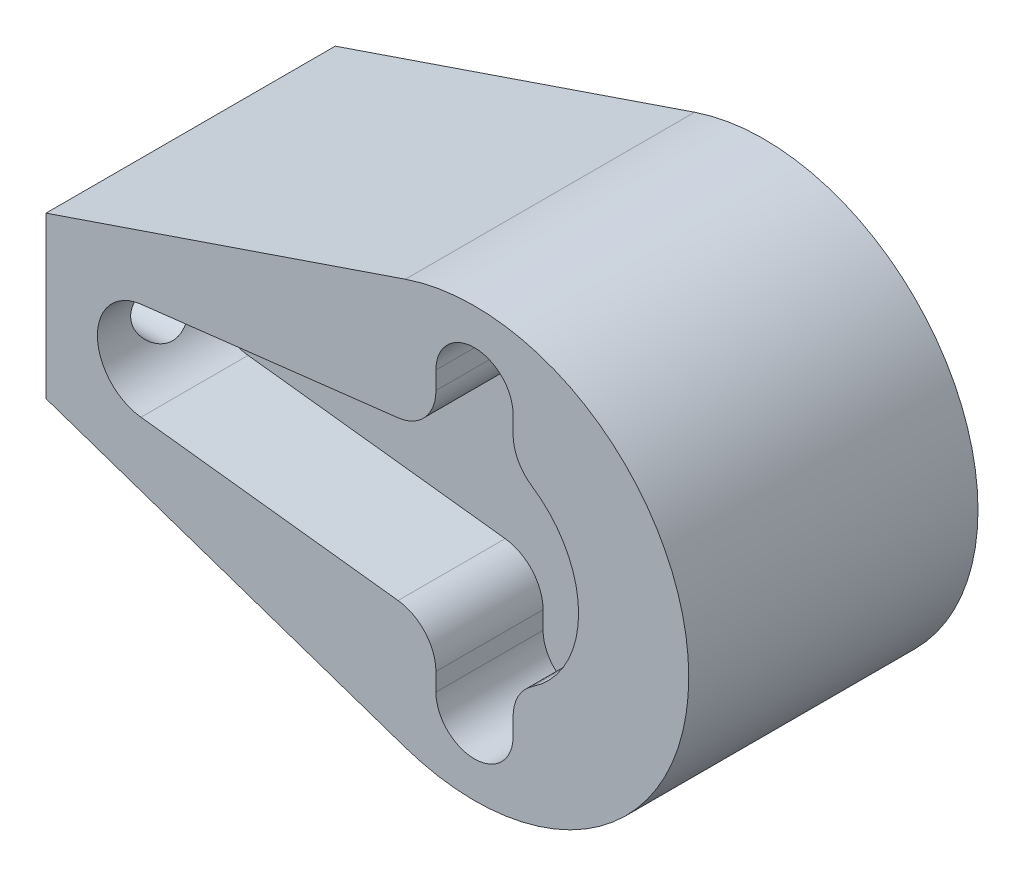
ISO-10303-21;
HEADER;
FILE_DESCRIPTION(('STEP AP214'),'2;1');
FILE_NAME('part.step','',(''),(''),'','','');
FILE_SCHEMA(('AUTOMOTIVE_DESIGN { 1 0 10303 214 1 1 1 1 }'));
ENDSEC;
DATA;
#1=APPLICATION_CONTEXT('core data for automotive mechanical design processes');
#2=APPLICATION_PROTOCOL_DEFINITION('international standard','automotive_design',2000,#1);
#3=PRODUCT_CONTEXT('',#1,'mechanical');
#4=PRODUCT('Part','Part','',(#3));
#5=PRODUCT_RELATED_PRODUCT_CATEGORY('part','',(#4));
#6=PRODUCT_DEFINITION_FORMATION('','',#4);
#7=PRODUCT_DEFINITION_CONTEXT('part definition',#1,'design');
#8=PRODUCT_DEFINITION('design','',#6,#7);
#9=PRODUCT_DEFINITION_SHAPE('','',#8);
#10=(LENGTH_UNIT() NAMED_UNIT(*) SI_UNIT(.MILLI.,.METRE.));
#11=(NAMED_UNIT(*) PLANE_ANGLE_UNIT() SI_UNIT($,.RADIAN.));
#12=(NAMED_UNIT(*) SI_UNIT($,.STERADIAN.) SOLID_ANGLE_UNIT());
#13=UNCERTAINTY_MEASURE_WITH_UNIT(LENGTH_MEASURE(1.E-05),#10,'distance_accuracy_value','');
#14=(GEOMETRIC_REPRESENTATION_CONTEXT(3) GLOBAL_UNCERTAINTY_ASSIGNED_CONTEXT((#13)) GLOBAL_UNIT_ASSIGNED_CONTEXT((#10,
#11,#12)) REPRESENTATION_CONTEXT('',''));
#15=CARTESIAN_POINT('',(0.,0.,0.));
#16=DIRECTION('',(0.,0.,1.));
#17=DIRECTION('',(1.,0.,0.));
#18=AXIS2_PLACEMENT_3D('',#15,#16,#17);
#19=CARTESIAN_POINT('',(0.,0.,5.));
#20=DIRECTION('',(0.,0.,1.));
#21=DIRECTION('',(1.,0.,0.));
#22=AXIS2_PLACEMENT_3D('',#19,#20,#21);
#23=PLANE('',#22);
#24=DIRECTION('',(-0.946562830415567,-0.322519469297081,0.));
#25=VECTOR('',#24,1.);
#26=CARTESIAN_POINT('',(-20.,3.75000000000001,5.));
#27=LINE('',#26,#25);
#28=CARTESIAN_POINT('',(-3.2251946929708,9.46562830415567,5.));
#29=VERTEX_POINT('',#28);
#30=CARTESIAN_POINT('',(-20.,3.75000000000001,5.));
#31=VERTEX_POINT('',#30);
#32=EDGE_CURVE('E306',#29,#31,#27,.T.);
#33=ORIENTED_EDGE('',*,*,#32,.T.);
#34=DIRECTION('',(0.,-1.,0.));
#35=VECTOR('',#34,1.);
#36=CARTESIAN_POINT('',(-20.,3.75000000000001,5.));
#37=LINE('',#36,#35);
#38=CARTESIAN_POINT('',(-20.,-3.74999999999999,5.));
#39=VERTEX_POINT('',#38);
#40=EDGE_CURVE('E308',#31,#39,#37,.T.);
#41=ORIENTED_EDGE('',*,*,#40,.T.);
#42=DIRECTION('',(0.946562830415567,-0.322519469297082,0.));
#43=VECTOR('',#42,1.);
#44=CARTESIAN_POINT('',(-3.22519469297081,-9.46562830415567,5.));
#45=LINE('',#44,#43);
#46=CARTESIAN_POINT('',(-3.22519469297081,-9.46562830415567,5.));
#47=VERTEX_POINT('',#46);
#48=EDGE_CURVE('E310',#39,#47,#45,.T.);
#49=ORIENTED_EDGE('',*,*,#48,.T.);
#50=CARTESIAN_POINT('',(0.,0.,5.));
#51=DIRECTION('',(0.,0.,1.));
#52=DIRECTION('',(1.,0.,0.));
#53=AXIS2_PLACEMENT_3D('',#50,#51,#52);
#54=CIRCLE('',#53,10.);
#55=EDGE_CURVE('E74',#47,#29,#54,.T.);
#56=ORIENTED_EDGE('',*,*,#55,.T.);
#57=EDGE_LOOP('',(#33,#41,#49,#56));
#58=FACE_BOUND('',#57,.T.);
#59=DIRECTION('',(0.,-1.,0.));
#60=VECTOR('',#59,1.);
#61=CARTESIAN_POINT('',(-1.8,6.51204514524833,5.));
#62=LINE('',#61,#60);
#63=CARTESIAN_POINT('',(-1.8,6.51204514524833,5.));
#64=VERTEX_POINT('',#63);
#65=CARTESIAN_POINT('',(-1.8,5.67902493282993,5.));
#66=VERTEX_POINT('',#65);
#67=EDGE_CURVE('E211',#64,#66,#62,.T.);
#68=ORIENTED_EDGE('',*,*,#67,.F.);
#69=CARTESIAN_POINT('',(0.,6.51204508312374,5.));
#70=DIRECTION('',(0.,0.,1.));
#71=DIRECTION('',(1.,0.,0.));
#72=AXIS2_PLACEMENT_3D('',#69,#70,#71);
#73=CIRCLE('',#72,1.8);
#74=CARTESIAN_POINT('',(1.8,6.51204508312374,5.));
#75=VERTEX_POINT('',#74);
#76=EDGE_CURVE('E209',#75,#64,#73,.T.);
#77=ORIENTED_EDGE('',*,*,#76,.F.);
#78=DIRECTION('',(0.,1.,0.));
#79=VECTOR('',#78,1.);
#80=CARTESIAN_POINT('',(1.8,5.70875526646588,5.));
#81=LINE('',#80,#79);
#82=CARTESIAN_POINT('',(1.8,5.70875526646588,5.));
#83=VERTEX_POINT('',#82);
#84=EDGE_CURVE('E236',#83,#75,#81,.T.);
#85=ORIENTED_EDGE('',*,*,#84,.F.);
#86=CARTESIAN_POINT('',(3.8,5.70875526646588,5.));
#87=DIRECTION('',(0.,0.,-1.));
#88=DIRECTION('',(-1.,0.,0.));
#89=AXIS2_PLACEMENT_3D('',#86,#87,#88);
#90=CIRCLE('',#89,2.);
#91=CARTESIAN_POINT('',(2.69177836052674,4.04386944521471,5.));
#92=VERTEX_POINT('',#91);
#93=EDGE_CURVE('E234',#92,#83,#90,.T.);
#94=ORIENTED_EDGE('',*,*,#93,.F.);
#95=CARTESIAN_POINT('',(0.,0.,5.));
#96=DIRECTION('',(0.,0.,1.));
#97=DIRECTION('',(-1.,0.,0.));
#98=AXIS2_PLACEMENT_3D('',#95,#96,#97);
#99=CIRCLE('',#98,4.85783396506521);
#100=CARTESIAN_POINT('',(2.69177836052674,-4.04386944521471,5.));
#101=VERTEX_POINT('',#100);
#102=EDGE_CURVE('E232',#101,#92,#99,.T.);
#103=ORIENTED_EDGE('',*,*,#102,.F.);
#104=CARTESIAN_POINT('',(3.8,-5.70875526646588,5.));
#105=DIRECTION('',(0.,0.,-1.));
#106=DIRECTION('',(1.,0.,0.));
#107=AXIS2_PLACEMENT_3D('',#104,#105,#106);
#108=CIRCLE('',#107,2.);
#109=CARTESIAN_POINT('',(1.8,-5.70875526646588,5.));
#110=VERTEX_POINT('',#109);
#111=EDGE_CURVE('E230',#110,#101,#108,.T.);
#112=ORIENTED_EDGE('',*,*,#111,.F.);
#113=DIRECTION('',(0.,1.,0.));
#114=VECTOR('',#113,1.);
#115=CARTESIAN_POINT('',(1.8,-6.51204508312374,5.));
#116=LINE('',#115,#114);
#117=CARTESIAN_POINT('',(1.8,-6.51204508312374,5.));
#118=VERTEX_POINT('',#117);
#119=EDGE_CURVE('E228',#118,#110,#116,.T.);
#120=ORIENTED_EDGE('',*,*,#119,.F.);
#121=CARTESIAN_POINT('',(0.,-6.51204508312374,5.));
#122=DIRECTION('',(0.,0.,1.));
#123=DIRECTION('',(1.,0.,0.));
#124=AXIS2_PLACEMENT_3D('',#121,#122,#123);
#125=CIRCLE('',#124,1.8);
#126=CARTESIAN_POINT('',(-1.8,-6.51204508312374,5.));
#127=VERTEX_POINT('',#126);
#128=EDGE_CURVE('E226',#127,#118,#125,.T.);
#129=ORIENTED_EDGE('',*,*,#128,.F.);
#130=DIRECTION('',(0.,-1.,0.));
#131=VECTOR('',#130,1.);
#132=CARTESIAN_POINT('',(-1.8,-5.67902487070535,5.));
#133=LINE('',#132,#131);
#134=CARTESIAN_POINT('',(-1.8,-5.67902487070535,5.));
#135=VERTEX_POINT('',#134);
#136=EDGE_CURVE('E224',#135,#127,#133,.T.);
#137=ORIENTED_EDGE('',*,*,#136,.F.);
#138=CARTESIAN_POINT('',(-3.8,-5.67902487070535,5.));
#139=DIRECTION('',(0.,0.,-1.));
#140=DIRECTION('',(1.,0.,0.));
#141=AXIS2_PLACEMENT_3D('',#138,#139,#140);
#142=CIRCLE('',#141,2.);
#143=CARTESIAN_POINT('',(-3.56690060413346,-3.6926551489147,5.));
#144=VERTEX_POINT('',#143);
#145=EDGE_CURVE('E222',#144,#135,#142,.T.);
#146=ORIENTED_EDGE('',*,*,#145,.F.);
#147=DIRECTION('',(0.993184860895324,-0.116549697933267,0.));
#148=VECTOR('',#147,1.);
#149=CARTESIAN_POINT('',(-15.5680643052465,-2.28432518005924,5.));
#150=LINE('',#149,#148);
#151=CARTESIAN_POINT('',(-15.5680643052465,-2.28432518005924,5.));
#152=VERTEX_POINT('',#151);
#153=EDGE_CURVE('E220',#152,#144,#150,.T.);
#154=ORIENTED_EDGE('',*,*,#153,.F.);
#155=CARTESIAN_POINT('',(-15.3,0.,5.));
#156=DIRECTION('',(0.,0.,1.));
#157=DIRECTION('',(1.,0.,0.));
#158=AXIS2_PLACEMENT_3D('',#155,#156,#157);
#159=CIRCLE('',#158,2.3);
#160=CARTESIAN_POINT('',(-15.5680642879125,2.28432518209339,5.));
#161=VERTEX_POINT('',#160);
#162=EDGE_CURVE('E218',#161,#152,#159,.T.);
#163=ORIENTED_EDGE('',*,*,#162,.F.);
#164=DIRECTION('',(-0.993184860300195,-0.116549703004697,0.));
#165=VECTOR('',#164,1.);
#166=CARTESIAN_POINT('',(-3.5669005939906,3.69265521222954,5.));
#167=LINE('',#166,#165);
#168=CARTESIAN_POINT('',(-3.5669005939906,3.69265521222954,5.));
#169=VERTEX_POINT('',#168);
#170=EDGE_CURVE('E216',#169,#161,#167,.T.);
#171=ORIENTED_EDGE('',*,*,#170,.F.);
#172=CARTESIAN_POINT('',(-3.8,5.67902493282993,5.));
#173=DIRECTION('',(0.,0.,-1.));
#174=DIRECTION('',(-1.,0.,0.));
#175=AXIS2_PLACEMENT_3D('',#172,#173,#174);
#176=CIRCLE('',#175,2.);
#177=EDGE_CURVE('E214',#66,#169,#176,.T.);
#178=ORIENTED_EDGE('',*,*,#177,.F.);
#179=EDGE_LOOP('',(#68,#77,#85,#94,#103,#112,#120,#129,#137,#146,#154,#163,#171,#178));
#180=FACE_BOUND('',#179,.T.);
#181=ADVANCED_FACE('F45',(#58,#180),#23,.T.);
#182=CARTESIAN_POINT('',(-20.,3.75000000000001,5.));
#183=DIRECTION('',(0.322519469297081,-0.946562830415567,0.));
#184=DIRECTION('',(0.946562830415567,0.322519469297081,0.));
#185=AXIS2_PLACEMENT_3D('',#182,#183,#184);
#186=PLANE('',#185);
#187=DIRECTION('',(0.,0.,-1.));
#188=VECTOR('',#187,1.);
#189=CARTESIAN_POINT('',(-3.2251946929708,9.46562830415567,5.));
#190=LINE('',#189,#188);
#191=CARTESIAN_POINT('',(-3.2251946929708,9.46562830415567,-8.5));
#192=VERTEX_POINT('',#191);
#193=EDGE_CURVE('E185',#29,#192,#190,.T.);
#194=ORIENTED_EDGE('',*,*,#193,.T.);
#195=DIRECTION('',(-0.946562830415567,-0.322519469297081,0.));
#196=VECTOR('',#195,1.);
#197=CARTESIAN_POINT('',(-3.22519469297081,9.46562830415567,-8.5));
#198=LINE('',#197,#196);
#199=CARTESIAN_POINT('',(-20.,3.75,-8.5));
#200=VERTEX_POINT('',#199);
#201=EDGE_CURVE('E195',#192,#200,#198,.T.);
#202=ORIENTED_EDGE('',*,*,#201,.T.);
#203=DIRECTION('',(0.,0.,-1.));
#204=VECTOR('',#203,1.);
#205=CARTESIAN_POINT('',(-20.,3.75000000000001,5.));
#206=LINE('',#205,#204);
#207=EDGE_CURVE('E59',#31,#200,#206,.T.);
#208=ORIENTED_EDGE('',*,*,#207,.F.);
#209=ORIENTED_EDGE('',*,*,#32,.F.);
#210=EDGE_LOOP('',(#194,#202,#208,#209));
#211=FACE_BOUND('',#210,.T.);
#212=ADVANCED_FACE('F47',(#211),#186,.F.);
#213=CARTESIAN_POINT('',(-20.,3.75000000000001,5.));
#214=DIRECTION('',(1.,0.,0.));
#215=DIRECTION('',(0.,0.,-1.));
#216=AXIS2_PLACEMENT_3D('',#213,#214,#215);
#217=PLANE('',#216);
#218=CARTESIAN_POINT('',(-20.,0.,-5.49999999999995));
#219=DIRECTION('',(-1.,0.,0.));
#220=DIRECTION('',(0.,0.,1.));
#221=AXIS2_PLACEMENT_3D('',#218,#219,#220);
#222=CIRCLE('',#221,1.45);
#223=CARTESIAN_POINT('',(-20.,0.,-4.04999999999995));
#224=VERTEX_POINT('',#223);
#225=EDGE_CURVE('E419',#224,#224,#222,.T.);
#226=ORIENTED_EDGE('',*,*,#225,.F.);
#227=EDGE_LOOP('',(#226));
#228=FACE_BOUND('',#227,.T.);
#229=CARTESIAN_POINT('',(-20.,0.,2.));
#230=DIRECTION('',(-1.,0.,0.));
#231=DIRECTION('',(0.,0.,1.));
#232=AXIS2_PLACEMENT_3D('',#229,#230,#231);
#233=CIRCLE('',#232,1.45);
#234=CARTESIAN_POINT('',(-20.,0.,3.45));
#235=VERTEX_POINT('',#234);
#236=EDGE_CURVE('E422',#235,#235,#233,.T.);
#237=ORIENTED_EDGE('',*,*,#236,.F.);
#238=EDGE_LOOP('',(#237));
#239=FACE_BOUND('',#238,.T.);
#240=ORIENTED_EDGE('',*,*,#207,.T.);
#241=DIRECTION('',(0.,-1.,0.));
#242=VECTOR('',#241,1.);
#243=CARTESIAN_POINT('',(-20.,0.,-8.5));
#244=LINE('',#243,#242);
#245=CARTESIAN_POINT('',(-20.,-3.74999999999999,-8.5));
#246=VERTEX_POINT('',#245);
#247=EDGE_CURVE('E206',#200,#246,#244,.T.);
#248=ORIENTED_EDGE('',*,*,#247,.T.);
#249=DIRECTION('',(0.,0.,-1.));
#250=VECTOR('',#249,1.);
#251=CARTESIAN_POINT('',(-20.,-3.74999999999999,5.));
#252=LINE('',#251,#250);
#253=EDGE_CURVE('E184',#39,#246,#252,.T.);
#254=ORIENTED_EDGE('',*,*,#253,.F.);
#255=ORIENTED_EDGE('',*,*,#40,.F.);
#256=EDGE_LOOP('',(#240,#248,#254,#255));
#257=FACE_BOUND('',#256,.T.);
#258=ADVANCED_FACE('F317',(#228,#239,#257),#217,.F.);
#259=CARTESIAN_POINT('',(-3.22519469297081,-9.46562830415567,5.));
#260=DIRECTION('',(0.322519469297082,0.946562830415567,0.));
#261=DIRECTION('',(-0.946562830415567,0.322519469297082,0.));
#262=AXIS2_PLACEMENT_3D('',#259,#260,#261);
#263=PLANE('',#262);
#264=ORIENTED_EDGE('',*,*,#253,.T.);
#265=DIRECTION('',(0.946562830415567,-0.322519469297082,0.));
#266=VECTOR('',#265,1.);
#267=CARTESIAN_POINT('',(-3.22519469297082,-9.46562830415567,-8.5));
#268=LINE('',#267,#266);
#269=CARTESIAN_POINT('',(-3.22519469297081,-9.46562830415567,-8.5));
#270=VERTEX_POINT('',#269);
#271=EDGE_CURVE('E192',#246,#270,#268,.T.);
#272=ORIENTED_EDGE('',*,*,#271,.T.);
#273=DIRECTION('',(0.,0.,-1.));
#274=VECTOR('',#273,1.);
#275=CARTESIAN_POINT('',(-3.22519469297081,-9.46562830415567,5.));
#276=LINE('',#275,#274);
#277=EDGE_CURVE('E177',#47,#270,#276,.T.);
#278=ORIENTED_EDGE('',*,*,#277,.F.);
#279=ORIENTED_EDGE('',*,*,#48,.F.);
#280=EDGE_LOOP('',(#264,#272,#278,#279));
#281=FACE_BOUND('',#280,.T.);
#282=ADVANCED_FACE('F197',(#281),#263,.F.);
#283=CARTESIAN_POINT('',(0.,0.,5.));
#284=DIRECTION('',(0.,0.,-1.));
#285=DIRECTION('',(-1.,0.,0.));
#286=AXIS2_PLACEMENT_3D('',#283,#284,#285);
#287=CYLINDRICAL_SURFACE('',#286,10.);
#288=ORIENTED_EDGE('',*,*,#277,.T.);
#289=CARTESIAN_POINT('',(0.,0.,-8.5));
#290=DIRECTION('',(0.,0.,1.));
#291=DIRECTION('',(1.,0.,0.));
#292=AXIS2_PLACEMENT_3D('',#289,#290,#291);
#293=CIRCLE('',#292,10.);
#294=EDGE_CURVE('E180',#270,#192,#293,.T.);
#295=ORIENTED_EDGE('',*,*,#294,.T.);
#296=ORIENTED_EDGE('',*,*,#193,.F.);
#297=ORIENTED_EDGE('',*,*,#55,.F.);
#298=EDGE_LOOP('',(#288,#295,#296,#297));
#299=FACE_BOUND('',#298,.T.);
#300=ADVANCED_FACE('F179',(#299),#287,.T.);
#301=CARTESIAN_POINT('',(0.,6.51204508312374,5.));
#302=DIRECTION('',(0.,0.,-1.));
#303=DIRECTION('',(-1.,0.,0.));
#304=AXIS2_PLACEMENT_3D('',#301,#302,#303);
#305=CYLINDRICAL_SURFACE('',#304,1.8);
#306=CARTESIAN_POINT('',(0.,6.51204508312374,0.));
#307=DIRECTION('',(0.,0.,1.));
#308=DIRECTION('',(1.,0.,0.));
#309=AXIS2_PLACEMENT_3D('',#306,#307,#308);
#310=CIRCLE('',#309,1.8);
#311=CARTESIAN_POINT('',(1.8,6.51204508312374,0.));
#312=VERTEX_POINT('',#311);
#313=CARTESIAN_POINT('',(-1.8,6.51204514524833,0.));
#314=VERTEX_POINT('',#313);
#315=EDGE_CURVE('E208',#312,#314,#310,.T.);
#316=ORIENTED_EDGE('',*,*,#315,.F.);
#317=DIRECTION('',(0.,0.,-1.));
#318=VECTOR('',#317,1.);
#319=CARTESIAN_POINT('',(1.8,6.51204508312374,5.));
#320=LINE('',#319,#318);
#321=EDGE_CURVE('E238',#75,#312,#320,.T.);
#322=ORIENTED_EDGE('',*,*,#321,.F.);
#323=ORIENTED_EDGE('',*,*,#76,.T.);
#324=DIRECTION('',(0.,0.,-1.));
#325=VECTOR('',#324,1.);
#326=CARTESIAN_POINT('',(-1.8,6.51204514524833,5.));
#327=LINE('',#326,#325);
#328=EDGE_CURVE('E303',#64,#314,#327,.T.);
#329=ORIENTED_EDGE('',*,*,#328,.T.);
#330=EDGE_LOOP('',(#316,#322,#323,#329));
#331=FACE_BOUND('',#330,.T.);
#332=ADVANCED_FACE('F341',(#331),#305,.F.);
#333=CARTESIAN_POINT('',(-1.8,6.51204514524833,5.));
#334=DIRECTION('',(1.,0.,0.));
#335=DIRECTION('',(0.,0.,-1.));
#336=AXIS2_PLACEMENT_3D('',#333,#334,#335);
#337=PLANE('',#336);
#338=DIRECTION('',(0.,-1.,0.));
#339=VECTOR('',#338,1.);
#340=CARTESIAN_POINT('',(-1.8,6.51204514524833,0.));
#341=LINE('',#340,#339);
#342=CARTESIAN_POINT('',(-1.8,5.67902493282993,0.));
#343=VERTEX_POINT('',#342);
#344=EDGE_CURVE('E241',#314,#343,#341,.T.);
#345=ORIENTED_EDGE('',*,*,#344,.F.);
#346=ORIENTED_EDGE('',*,*,#328,.F.);
#347=ORIENTED_EDGE('',*,*,#67,.T.);
#348=DIRECTION('',(0.,0.,-1.));
#349=VECTOR('',#348,1.);
#350=CARTESIAN_POINT('',(-1.8,5.67902493282993,5.));
#351=LINE('',#350,#349);
#352=EDGE_CURVE('E301',#66,#343,#351,.T.);
#353=ORIENTED_EDGE('',*,*,#352,.T.);
#354=EDGE_LOOP('',(#345,#346,#347,#353));
#355=FACE_BOUND('',#354,.T.);
#356=ADVANCED_FACE('F331',(#355),#337,.T.);
#357=CARTESIAN_POINT('',(-3.8,5.67902493282993,5.));
#358=DIRECTION('',(0.,0.,-1.));
#359=DIRECTION('',(-1.,0.,0.));
#360=AXIS2_PLACEMENT_3D('',#357,#358,#359);
#361=CYLINDRICAL_SURFACE('',#360,2.);
#362=CARTESIAN_POINT('',(-3.8,5.67902493282993,0.));
#363=DIRECTION('',(0.,0.,-1.));
#364=DIRECTION('',(-1.,0.,0.));
#365=AXIS2_PLACEMENT_3D('',#362,#363,#364);
#366=CIRCLE('',#365,2.);
#367=CARTESIAN_POINT('',(-3.5669005939906,3.69265521222954,0.));
#368=VERTEX_POINT('',#367);
#369=EDGE_CURVE('E244',#343,#368,#366,.T.);
#370=ORIENTED_EDGE('',*,*,#369,.F.);
#371=ORIENTED_EDGE('',*,*,#352,.F.);
#372=ORIENTED_EDGE('',*,*,#177,.T.);
#373=DIRECTION('',(0.,0.,-1.));
#374=VECTOR('',#373,1.);
#375=CARTESIAN_POINT('',(-3.5669005939906,3.69265521222954,5.));
#376=LINE('',#375,#374);
#377=EDGE_CURVE('E299',#169,#368,#376,.T.);
#378=ORIENTED_EDGE('',*,*,#377,.T.);
#379=EDGE_LOOP('',(#370,#371,#372,#378));
#380=FACE_BOUND('',#379,.T.);
#381=ADVANCED_FACE('F334',(#380),#361,.T.);
#382=CARTESIAN_POINT('',(-3.5669005939906,3.69265521222954,5.));
#383=DIRECTION('',(0.116549703004697,-0.993184860300194,0.));
#384=DIRECTION('',(0.993184860300195,0.116549703004697,0.));
#385=AXIS2_PLACEMENT_3D('',#382,#383,#384);
#386=PLANE('',#385);
#387=DIRECTION('',(-0.993184860300195,-0.116549703004697,0.));
#388=VECTOR('',#387,1.);
#389=CARTESIAN_POINT('',(-3.5669005939906,3.69265521222954,0.));
#390=LINE('',#389,#388);
#391=CARTESIAN_POINT('',(-15.5680642879125,2.28432518209339,0.));
#392=VERTEX_POINT('',#391);
#393=EDGE_CURVE('E247',#368,#392,#390,.T.);
#394=ORIENTED_EDGE('',*,*,#393,.F.);
#395=ORIENTED_EDGE('',*,*,#377,.F.);
#396=ORIENTED_EDGE('',*,*,#170,.T.);
#397=DIRECTION('',(0.,0.,-1.));
#398=VECTOR('',#397,1.);
#399=CARTESIAN_POINT('',(-15.5680642879125,2.28432518209339,5.));
#400=LINE('',#399,#398);
#401=EDGE_CURVE('E297',#161,#392,#400,.T.);
#402=ORIENTED_EDGE('',*,*,#401,.T.);
#403=EDGE_LOOP('',(#394,#395,#396,#402));
#404=FACE_BOUND('',#403,.T.);
#405=ADVANCED_FACE('F390',(#404),#386,.T.);
#406=CARTESIAN_POINT('',(-15.3,0.,5.));
#407=DIRECTION('',(0.,0.,-1.));
#408=DIRECTION('',(-1.,0.,0.));
#409=AXIS2_PLACEMENT_3D('',#406,#407,#408);
#410=CYLINDRICAL_SURFACE('',#409,2.3);
#411=CARTESIAN_POINT('',(-17.6,0.,3.45));
#412=CARTESIAN_POINT('',(-17.5999952348965,-0.0735620306128953,3.44999489466359));
#413=CARTESIAN_POINT('',(-17.5964344010985,-0.147204816500886,3.44436454038917));
#414=CARTESIAN_POINT('',(-17.5825288023698,-0.292222150830422,3.42214972007909));
#415=CARTESIAN_POINT('',(-17.5721719631101,-0.363592424662499,3.40554575707086));
#416=CARTESIAN_POINT('',(-17.5457137552372,-0.501687146257933,3.36235803067236));
#417=CARTESIAN_POINT('',(-17.5296408024331,-0.568432657758621,3.33582359983808));
#418=CARTESIAN_POINT('',(-17.4930826736694,-0.696287490334186,3.27386660131413));
#419=CARTESIAN_POINT('',(-17.4725978628067,-0.757397277187965,3.23844476904842));
#420=CARTESIAN_POINT('',(-17.426950125782,-0.877812735953125,3.15657513173879));
#421=CARTESIAN_POINT('',(-17.4015432742224,-0.93657646197989,3.10946895478235));
#422=CARTESIAN_POINT('',(-17.3493374345192,-1.04589405901631,3.0070873648058));
#423=CARTESIAN_POINT('',(-17.3225365901337,-1.09643659311134,2.95180086840201));
#424=CARTESIAN_POINT('',(-17.2661214190627,-1.19499512553422,2.82568309784669));
#425=CARTESIAN_POINT('',(-17.2366305522551,-1.24169517024988,2.75375944254787));
#426=CARTESIAN_POINT('',(-17.1825785767486,-1.32221621662578,2.6013636116136));
#427=CARTESIAN_POINT('',(-17.1580091248782,-1.35605910362773,2.52090626338433));
#428=CARTESIAN_POINT('',(-17.1233727634214,-1.40211061447188,2.37521648682557));
#429=CARTESIAN_POINT('',(-17.1111908897692,-1.41766875371427,2.31154918652));
#430=CARTESIAN_POINT('',(-17.0934485814678,-1.44005311205601,2.18183278976447));
#431=CARTESIAN_POINT('',(-17.0878785392774,-1.4468920020236,2.11578729327668));
#432=CARTESIAN_POINT('',(-17.0842014340546,-1.45142555775087,1.98298188931665));
#433=CARTESIAN_POINT('',(-17.0861151605533,-1.44909475044668,1.91622050623561));
#434=CARTESIAN_POINT('',(-17.0971425136219,-1.4353921070893,1.78422051904625));
#435=CARTESIAN_POINT('',(-17.1062619769334,-1.42401294169937,1.71898319356854));
#436=CARTESIAN_POINT('',(-17.1300673897753,-1.39327464868554,1.59334462871705));
#437=CARTESIAN_POINT('',(-17.1446068273489,-1.37412447435822,1.53286283425977));
#438=CARTESIAN_POINT('',(-17.177649994476,-1.32861564637027,1.41585421448835));
#439=CARTESIAN_POINT('',(-17.1961551171488,-1.302254458626,1.35932878830152));
#440=CARTESIAN_POINT('',(-17.2392715562425,-1.23734120926279,1.2404600473076));
#441=CARTESIAN_POINT('',(-17.264375690463,-1.19742614584487,1.17904032558527));
#442=CARTESIAN_POINT('',(-17.3155868086833,-1.10906437514527,1.06309122376005));
#443=CARTESIAN_POINT('',(-17.3416948134388,-1.0606087941761,1.00856911255495));
#444=CARTESIAN_POINT('',(-17.3972097521984,-0.946769276272597,0.898445536758642));
#445=CARTESIAN_POINT('',(-17.4264174097691,-0.87990748206543,0.844253687586904));
#446=CARTESIAN_POINT('',(-17.4802891263742,-0.736347084624815,0.747900556502855));
#447=CARTESIAN_POINT('',(-17.5049547925712,-0.659651977221197,0.705735016226869));
#448=CARTESIAN_POINT('',(-17.5458676970746,-0.502328351889401,0.637232229649256));
#449=CARTESIAN_POINT('',(-17.5624835711877,-0.422106839363462,0.610190670448062));
#450=CARTESIAN_POINT('',(-17.5871175677954,-0.256958383189033,0.570435196717669));
#451=CARTESIAN_POINT('',(-17.5951482982089,-0.172038532839721,0.55770027043614));
#452=CARTESIAN_POINT('',(-17.6011094199397,-0.0139062419855043,0.548239002867977));
#453=CARTESIAN_POINT('',(-17.6003825074458,0.0591365720717499,0.549384698433762));
#454=CARTESIAN_POINT('',(-17.5920948248622,0.203831017840856,0.562562662255785));
#455=CARTESIAN_POINT('',(-17.5845346085094,0.27548276179755,0.574594048389775));
#456=CARTESIAN_POINT('',(-17.5637556349584,0.412313766043555,0.608147587689575));
#457=CARTESIAN_POINT('',(-17.5507920606776,0.477638746985116,0.629242917532434));
#458=CARTESIAN_POINT('',(-17.5202944320549,0.603742580802657,0.679918100815014));
#459=CARTESIAN_POINT('',(-17.5027596365758,0.664520694431703,0.709499330161094));
#460=CARTESIAN_POINT('',(-17.462425177632,0.786409671325798,0.779555368406544));
#461=CARTESIAN_POINT('',(-17.4392744090311,0.846946255053388,0.820823627535912));
#462=CARTESIAN_POINT('',(-17.390689613049,0.960650046320786,0.911447193796371));
#463=CARTESIAN_POINT('',(-17.3652531080108,1.01380909417649,0.960811325557832));
#464=CARTESIAN_POINT('',(-17.3102073056508,1.11942514034986,1.07464612717275));
#465=CARTESIAN_POINT('',(-17.2805379463955,1.17061212571905,1.14027134375415));
#466=CARTESIAN_POINT('',(-17.2239534301028,1.26145429803293,1.28015500446158));
#467=CARTESIAN_POINT('',(-17.1970366223709,1.30111642298745,1.35440821665069));
#468=CARTESIAN_POINT('',(-17.1546600984789,1.36061976148053,1.49430113521248));
#469=CARTESIAN_POINT('',(-17.1379821458822,1.38286417075097,1.5585437897373));
#470=CARTESIAN_POINT('',(-17.1108026495284,1.41827300878612,1.69070289273759));
#471=CARTESIAN_POINT('',(-17.1002912848323,1.43145188117914,1.75861331047763));
#472=CARTESIAN_POINT('',(-17.0870077711023,1.44800737277798,1.89683697720636));
#473=CARTESIAN_POINT('',(-17.084283659644,1.45132315416024,1.96716244379555));
#474=CARTESIAN_POINT('',(-17.0872086822455,1.44771848937246,2.10738653098096));
#475=CARTESIAN_POINT('',(-17.0928600167598,1.44079535316489,2.17728503455742));
#476=CARTESIAN_POINT('',(-17.1107131077057,1.41827174300572,2.3082772997176));
#477=CARTESIAN_POINT('',(-17.1222935326362,1.40348997017075,2.36960405907805));
#478=CARTESIAN_POINT('',(-17.1501628662752,1.36653963338584,2.48884570593964));
#479=CARTESIAN_POINT('',(-17.1664538205535,1.3443678596528,2.54675909798867));
#480=CARTESIAN_POINT('',(-17.2047162257004,1.28969646023056,2.66641095920689));
#481=CARTESIAN_POINT('',(-17.2271655297386,1.25617844430606,2.72752823712582));
#482=CARTESIAN_POINT('',(-17.2740206169282,1.18118625036807,2.84385756991415));
#483=CARTESIAN_POINT('',(-17.2984279432207,1.13970576045437,2.89906488547626));
#484=CARTESIAN_POINT('',(-17.3523480637841,1.04004734065751,3.01375409626789));
#485=CARTESIAN_POINT('',(-17.3818789003488,0.9801898473691,3.07178148920097));
#486=CARTESIAN_POINT('',(-17.4381215821485,0.850546596371728,3.17730811945012));
#487=CARTESIAN_POINT('',(-17.464831492182,0.780754099167484,3.22480015360291));
#488=CARTESIAN_POINT('',(-17.5129382882932,0.631737420989186,3.30795888387403));
#489=CARTESIAN_POINT('',(-17.5342808472175,0.552427935034664,3.34350579870685));
#490=CARTESIAN_POINT('',(-17.568721051406,0.387239185676793,3.40003681158557));
#491=CARTESIAN_POINT('',(-17.5818472879828,0.301383884129032,3.42107143619192));
#492=CARTESIAN_POINT('',(-17.5933259151269,0.178693315661015,3.43939403153303));
#493=CARTESIAN_POINT('',(-17.5958210978622,0.143125230588924,3.44336352112601));
#494=CARTESIAN_POINT('',(-17.5991593503587,0.071711173110535,3.44866782717223));
#495=CARTESIAN_POINT('',(-17.6000023232273,0.0358651845305357,3.45000248910791));
#496=CARTESIAN_POINT('',(-17.6,0.,3.45));
#497=B_SPLINE_CURVE_WITH_KNOTS('',3,(#411,#412,#413,#414,#415,#416,#417,#418,#419,#420,#421,
#422,#423,#424,#425,#426,#427,#428,#429,#430,#431,#432,#433,#434,#435,#436,#437,#438,#439,#440,
#441,#442,#443,#444,#445,#446,#447,#448,#449,#450,#451,#452,#453,#454,#455,#456,#457,#458,#459,
#460,#461,#462,#463,#464,#465,#466,#467,#468,#469,#470,#471,#472,#473,#474,#475,#476,#477,#478,
#479,#480,#481,#482,#483,#484,#485,#486,#487,#488,#489,#490,#491,#492,#493,#494,#495,#496),
.UNSPECIFIED.,.T.,.F.,(4,2,2,2,2,2,2,2,2,2,2,2,2,2,2,2,2,2,2,2,2,2,2,2,2,2,2,2,2,2,2,2,2,2,2,2,
2,2,2,2,2,2,4),(0.,0.22053607919336,0.441465045262475,0.66131074334776,0.881138255408335,
1.11867524445559,1.35653706665248,1.62729247291689,1.89758491439274,2.09674928714272,
2.29562390183599,2.49505137208029,2.69464054700826,2.88918532836884,3.0837985643918,
3.31524408654109,3.5469315160507,3.81823622716937,4.08944475312384,4.3466626712819,
4.60350232477148,4.82153731411336,5.03955463656595,5.24827027092186,5.45701976564096,
5.68664020787299,5.91651262417004,6.18043011786651,6.44418840149648,6.65336813503306,
6.86221381708503,7.07234506349236,7.28253152680702,7.47419009370381,7.66593201456026,
7.88484937121314,8.10394098698854,8.36807388613169,8.6323868235906,8.89927618056111,
9.1652315711215,9.27274768099725,9.38027009588996),.UNSPECIFIED.);
#498=CARTESIAN_POINT('',(-17.6,0.,3.45));
#499=VERTEX_POINT('',#498);
#500=EDGE_CURVE('E49',#499,#499,#497,.T.);
#501=ORIENTED_EDGE('',*,*,#500,.F.);
#502=EDGE_LOOP('',(#501));
#503=FACE_BOUND('',#502,.T.);
#504=CARTESIAN_POINT('',(-15.3,0.,0.));
#505=DIRECTION('',(0.,0.,1.));
#506=DIRECTION('',(1.,0.,0.));
#507=AXIS2_PLACEMENT_3D('',#504,#505,#506);
#508=CIRCLE('',#507,2.3);
#509=CARTESIAN_POINT('',(-15.5680643052465,-2.28432518005924,0.));
#510=VERTEX_POINT('',#509);
#511=EDGE_CURVE('E250',#392,#510,#508,.T.);
#512=ORIENTED_EDGE('',*,*,#511,.F.);
#513=ORIENTED_EDGE('',*,*,#401,.F.);
#514=ORIENTED_EDGE('',*,*,#162,.T.);
#515=DIRECTION('',(0.,0.,-1.));
#516=VECTOR('',#515,1.);
#517=CARTESIAN_POINT('',(-15.5680643052465,-2.28432518005924,5.));
#518=LINE('',#517,#516);
#519=EDGE_CURVE('E295',#152,#510,#518,.T.);
#520=ORIENTED_EDGE('',*,*,#519,.T.);
#521=EDGE_LOOP('',(#512,#513,#514,#520));
#522=FACE_BOUND('',#521,.T.);
#523=ADVANCED_FACE('F387',(#503,#522),#410,.F.);
#524=CARTESIAN_POINT('',(-15.5680643052465,-2.28432518005924,5.));
#525=DIRECTION('',(0.116549697933267,0.993184860895324,0.));
#526=DIRECTION('',(-0.993184860895324,0.116549697933267,0.));
#527=AXIS2_PLACEMENT_3D('',#524,#525,#526);
#528=PLANE('',#527);
#529=DIRECTION('',(0.993184860895324,-0.116549697933267,0.));
#530=VECTOR('',#529,1.);
#531=CARTESIAN_POINT('',(-15.5680643052465,-2.28432518005924,0.));
#532=LINE('',#531,#530);
#533=CARTESIAN_POINT('',(-3.56690060413346,-3.6926551489147,0.));
#534=VERTEX_POINT('',#533);
#535=EDGE_CURVE('E253',#510,#534,#532,.T.);
#536=ORIENTED_EDGE('',*,*,#535,.F.);
#537=ORIENTED_EDGE('',*,*,#519,.F.);
#538=ORIENTED_EDGE('',*,*,#153,.T.);
#539=DIRECTION('',(0.,0.,-1.));
#540=VECTOR('',#539,1.);
#541=CARTESIAN_POINT('',(-3.56690060413346,-3.6926551489147,5.));
#542=LINE('',#541,#540);
#543=EDGE_CURVE('E293',#144,#534,#542,.T.);
#544=ORIENTED_EDGE('',*,*,#543,.T.);
#545=EDGE_LOOP('',(#536,#537,#538,#544));
#546=FACE_BOUND('',#545,.T.);
#547=ADVANCED_FACE('F383',(#546),#528,.T.);
#548=CARTESIAN_POINT('',(-3.8,-5.67902487070535,5.));
#549=DIRECTION('',(0.,0.,-1.));
#550=DIRECTION('',(-1.,0.,0.));
#551=AXIS2_PLACEMENT_3D('',#548,#549,#550);
#552=CYLINDRICAL_SURFACE('',#551,2.);
#553=CARTESIAN_POINT('',(-3.8,-5.67902487070535,0.));
#554=DIRECTION('',(0.,0.,-1.));
#555=DIRECTION('',(1.,0.,0.));
#556=AXIS2_PLACEMENT_3D('',#553,#554,#555);
#557=CIRCLE('',#556,2.);
#558=CARTESIAN_POINT('',(-1.8,-5.67902487070535,0.));
#559=VERTEX_POINT('',#558);
#560=EDGE_CURVE('E256',#534,#559,#557,.T.);
#561=ORIENTED_EDGE('',*,*,#560,.F.);
#562=ORIENTED_EDGE('',*,*,#543,.F.);
#563=ORIENTED_EDGE('',*,*,#145,.T.);
#564=DIRECTION('',(0.,0.,-1.));
#565=VECTOR('',#564,1.);
#566=CARTESIAN_POINT('',(-1.8,-5.67902487070535,5.));
#567=LINE('',#566,#565);
#568=EDGE_CURVE('E291',#135,#559,#567,.T.);
#569=ORIENTED_EDGE('',*,*,#568,.T.);
#570=EDGE_LOOP('',(#561,#562,#563,#569));
#571=FACE_BOUND('',#570,.T.);
#572=ADVANCED_FACE('F380',(#571),#552,.T.);
#573=CARTESIAN_POINT('',(-1.8,-5.67902487070535,5.));
#574=DIRECTION('',(1.,0.,0.));
#575=DIRECTION('',(0.,0.,-1.));
#576=AXIS2_PLACEMENT_3D('',#573,#574,#575);
#577=PLANE('',#576);
#578=DIRECTION('',(0.,-1.,0.));
#579=VECTOR('',#578,1.);
#580=CARTESIAN_POINT('',(-1.8,-5.67902487070535,0.));
#581=LINE('',#580,#579);
#582=CARTESIAN_POINT('',(-1.8,-6.51204508312374,0.));
#583=VERTEX_POINT('',#582);
#584=EDGE_CURVE('E259',#559,#583,#581,.T.);
#585=ORIENTED_EDGE('',*,*,#584,.F.);
#586=ORIENTED_EDGE('',*,*,#568,.F.);
#587=ORIENTED_EDGE('',*,*,#136,.T.);
#588=DIRECTION('',(0.,0.,-1.));
#589=VECTOR('',#588,1.);
#590=CARTESIAN_POINT('',(-1.8,-6.51204508312374,5.));
#591=LINE('',#590,#589);
#592=EDGE_CURVE('E289',#127,#583,#591,.T.);
#593=ORIENTED_EDGE('',*,*,#592,.T.);
#594=EDGE_LOOP('',(#585,#586,#587,#593));
#595=FACE_BOUND('',#594,.T.);
#596=ADVANCED_FACE('F372',(#595),#577,.T.);
#597=CARTESIAN_POINT('',(0.,-6.51204508312374,5.));
#598=DIRECTION('',(0.,0.,-1.));
#599=DIRECTION('',(-1.,0.,0.));
#600=AXIS2_PLACEMENT_3D('',#597,#598,#599);
#601=CYLINDRICAL_SURFACE('',#600,1.8);
#602=CARTESIAN_POINT('',(0.,-6.51204508312374,0.));
#603=DIRECTION('',(0.,0.,1.));
#604=DIRECTION('',(1.,0.,0.));
#605=AXIS2_PLACEMENT_3D('',#602,#603,#604);
#606=CIRCLE('',#605,1.8);
#607=CARTESIAN_POINT('',(1.8,-6.51204508312374,0.));
#608=VERTEX_POINT('',#607);
#609=EDGE_CURVE('E262',#583,#608,#606,.T.);
#610=ORIENTED_EDGE('',*,*,#609,.F.);
#611=ORIENTED_EDGE('',*,*,#592,.F.);
#612=ORIENTED_EDGE('',*,*,#128,.T.);
#613=DIRECTION('',(0.,0.,-1.));
#614=VECTOR('',#613,1.);
#615=CARTESIAN_POINT('',(1.8,-6.51204508312374,5.));
#616=LINE('',#615,#614);
#617=EDGE_CURVE('E287',#118,#608,#616,.T.);
#618=ORIENTED_EDGE('',*,*,#617,.T.);
#619=EDGE_LOOP('',(#610,#611,#612,#618));
#620=FACE_BOUND('',#619,.T.);
#621=ADVANCED_FACE('F368',(#620),#601,.F.);
#622=CARTESIAN_POINT('',(1.8,-6.51204508312374,5.));
#623=DIRECTION('',(-1.,0.,0.));
#624=DIRECTION('',(0.,0.,1.));
#625=AXIS2_PLACEMENT_3D('',#622,#623,#624);
#626=PLANE('',#625);
#627=DIRECTION('',(0.,1.,0.));
#628=VECTOR('',#627,1.);
#629=CARTESIAN_POINT('',(1.8,-6.51204508312374,0.));
#630=LINE('',#629,#628);
#631=CARTESIAN_POINT('',(1.8,-5.70875526646588,0.));
#632=VERTEX_POINT('',#631);
#633=EDGE_CURVE('E265',#608,#632,#630,.T.);
#634=ORIENTED_EDGE('',*,*,#633,.F.);
#635=ORIENTED_EDGE('',*,*,#617,.F.);
#636=ORIENTED_EDGE('',*,*,#119,.T.);
#637=DIRECTION('',(0.,0.,-1.));
#638=VECTOR('',#637,1.);
#639=CARTESIAN_POINT('',(1.8,-5.70875526646588,5.));
#640=LINE('',#639,#638);
#641=EDGE_CURVE('E285',#110,#632,#640,.T.);
#642=ORIENTED_EDGE('',*,*,#641,.T.);
#643=EDGE_LOOP('',(#634,#635,#636,#642));
#644=FACE_BOUND('',#643,.T.);
#645=ADVANCED_FACE('F365',(#644),#626,.T.);
#646=CARTESIAN_POINT('',(3.8,-5.70875526646588,5.));
#647=DIRECTION('',(0.,0.,-1.));
#648=DIRECTION('',(-1.,0.,0.));
#649=AXIS2_PLACEMENT_3D('',#646,#647,#648);
#650=CYLINDRICAL_SURFACE('',#649,2.);
#651=CARTESIAN_POINT('',(3.8,-5.70875526646588,0.));
#652=DIRECTION('',(0.,0.,-1.));
#653=DIRECTION('',(1.,0.,0.));
#654=AXIS2_PLACEMENT_3D('',#651,#652,#653);
#655=CIRCLE('',#654,2.);
#656=CARTESIAN_POINT('',(2.69177836052674,-4.04386944521471,0.));
#657=VERTEX_POINT('',#656);
#658=EDGE_CURVE('E268',#632,#657,#655,.T.);
#659=ORIENTED_EDGE('',*,*,#658,.F.);
#660=ORIENTED_EDGE('',*,*,#641,.F.);
#661=ORIENTED_EDGE('',*,*,#111,.T.);
#662=DIRECTION('',(0.,0.,-1.));
#663=VECTOR('',#662,1.);
#664=CARTESIAN_POINT('',(2.69177836052674,-4.04386944521471,5.));
#665=LINE('',#664,#663);
#666=EDGE_CURVE('E283',#101,#657,#665,.T.);
#667=ORIENTED_EDGE('',*,*,#666,.T.);
#668=EDGE_LOOP('',(#659,#660,#661,#667));
#669=FACE_BOUND('',#668,.T.);
#670=ADVANCED_FACE('F357',(#669),#650,.T.);
#671=CARTESIAN_POINT('',(0.,0.,5.));
#672=DIRECTION('',(0.,0.,-1.));
#673=DIRECTION('',(-1.,0.,0.));
#674=AXIS2_PLACEMENT_3D('',#671,#672,#673);
#675=CYLINDRICAL_SURFACE('',#674,4.85783396506521);
#676=CARTESIAN_POINT('',(0.,0.,0.));
#677=DIRECTION('',(0.,0.,1.));
#678=DIRECTION('',(-1.,0.,0.));
#679=AXIS2_PLACEMENT_3D('',#676,#677,#678);
#680=CIRCLE('',#679,4.85783396506521);
#681=CARTESIAN_POINT('',(2.69177836052674,4.04386944521471,0.));
#682=VERTEX_POINT('',#681);
#683=EDGE_CURVE('E271',#657,#682,#680,.T.);
#684=ORIENTED_EDGE('',*,*,#683,.F.);
#685=ORIENTED_EDGE('',*,*,#666,.F.);
#686=ORIENTED_EDGE('',*,*,#102,.T.);
#687=DIRECTION('',(0.,0.,-1.));
#688=VECTOR('',#687,1.);
#689=CARTESIAN_POINT('',(2.69177836052674,4.04386944521471,5.));
#690=LINE('',#689,#688);
#691=EDGE_CURVE('E281',#92,#682,#690,.T.);
#692=ORIENTED_EDGE('',*,*,#691,.T.);
#693=EDGE_LOOP('',(#684,#685,#686,#692));
#694=FACE_BOUND('',#693,.T.);
#695=ADVANCED_FACE('F353',(#694),#675,.F.);
#696=CARTESIAN_POINT('',(3.8,5.70875526646588,5.));
#697=DIRECTION('',(0.,0.,-1.));
#698=DIRECTION('',(-1.,0.,0.));
#699=AXIS2_PLACEMENT_3D('',#696,#697,#698);
#700=CYLINDRICAL_SURFACE('',#699,2.);
#701=CARTESIAN_POINT('',(3.8,5.70875526646588,0.));
#702=DIRECTION('',(0.,0.,-1.));
#703=DIRECTION('',(-1.,0.,0.));
#704=AXIS2_PLACEMENT_3D('',#701,#702,#703);
#705=CIRCLE('',#704,2.);
#706=CARTESIAN_POINT('',(1.8,5.70875526646588,0.));
#707=VERTEX_POINT('',#706);
#708=EDGE_CURVE('E274',#682,#707,#705,.T.);
#709=ORIENTED_EDGE('',*,*,#708,.F.);
#710=ORIENTED_EDGE('',*,*,#691,.F.);
#711=ORIENTED_EDGE('',*,*,#93,.T.);
#712=DIRECTION('',(0.,0.,-1.));
#713=VECTOR('',#712,1.);
#714=CARTESIAN_POINT('',(1.8,5.70875526646588,5.));
#715=LINE('',#714,#713);
#716=EDGE_CURVE('E66',#83,#707,#715,.T.);
#717=ORIENTED_EDGE('',*,*,#716,.T.);
#718=EDGE_LOOP('',(#709,#710,#711,#717));
#719=FACE_BOUND('',#718,.T.);
#720=ADVANCED_FACE('F350',(#719),#700,.T.);
#721=CARTESIAN_POINT('',(1.8,5.70875526646588,5.));
#722=DIRECTION('',(-1.,0.,0.));
#723=DIRECTION('',(0.,0.,1.));
#724=AXIS2_PLACEMENT_3D('',#721,#722,#723);
#725=PLANE('',#724);
#726=DIRECTION('',(0.,1.,0.));
#727=VECTOR('',#726,1.);
#728=CARTESIAN_POINT('',(1.8,5.70875526646588,0.));
#729=LINE('',#728,#727);
#730=EDGE_CURVE('E212',#707,#312,#729,.T.);
#731=ORIENTED_EDGE('',*,*,#730,.F.);
#732=ORIENTED_EDGE('',*,*,#716,.F.);
#733=ORIENTED_EDGE('',*,*,#84,.T.);
#734=ORIENTED_EDGE('',*,*,#321,.T.);
#735=EDGE_LOOP('',(#731,#732,#733,#734));
#736=FACE_BOUND('',#735,.T.);
#737=ADVANCED_FACE('F343',(#736),#725,.T.);
#738=CARTESIAN_POINT('',(0.,0.,0.));
#739=DIRECTION('',(0.,0.,1.));
#740=DIRECTION('',(1.,0.,0.));
#741=AXIS2_PLACEMENT_3D('',#738,#739,#740);
#742=PLANE('',#741);
#743=ORIENTED_EDGE('',*,*,#730,.T.);
#744=ORIENTED_EDGE('',*,*,#315,.T.);
#745=ORIENTED_EDGE('',*,*,#344,.T.);
#746=ORIENTED_EDGE('',*,*,#369,.T.);
#747=ORIENTED_EDGE('',*,*,#393,.T.);
#748=ORIENTED_EDGE('',*,*,#511,.T.);
#749=ORIENTED_EDGE('',*,*,#535,.T.);
#750=ORIENTED_EDGE('',*,*,#560,.T.);
#751=ORIENTED_EDGE('',*,*,#584,.T.);
#752=ORIENTED_EDGE('',*,*,#609,.T.);
#753=ORIENTED_EDGE('',*,*,#633,.T.);
#754=ORIENTED_EDGE('',*,*,#658,.T.);
#755=ORIENTED_EDGE('',*,*,#683,.T.);
#756=ORIENTED_EDGE('',*,*,#708,.T.);
#757=EDGE_LOOP('',(#743,#744,#745,#746,#747,#748,#749,#750,#751,#752,#753,#754,#755,#756));
#758=FACE_BOUND('',#757,.T.);
#759=ADVANCED_FACE('F338',(#758),#742,.T.);
#760=CARTESIAN_POINT('',(0.,0.,-8.5));
#761=DIRECTION('',(0.,0.,1.));
#762=DIRECTION('',(1.,0.,0.));
#763=AXIS2_PLACEMENT_3D('',#760,#761,#762);
#764=PLANE('',#763);
#765=CARTESIAN_POINT('',(0.,0.,-8.5));
#766=DIRECTION('',(0.,0.,1.));
#767=DIRECTION('',(1.,0.,0.));
#768=AXIS2_PLACEMENT_3D('',#765,#766,#767);
#769=CIRCLE('',#768,2.75);
#770=CARTESIAN_POINT('',(2.75,0.,-8.5));
#771=VERTEX_POINT('',#770);
#772=EDGE_CURVE('E11',#771,#771,#769,.F.);
#773=ORIENTED_EDGE('',*,*,#772,.F.);
#774=EDGE_LOOP('',(#773));
#775=FACE_BOUND('',#774,.T.);
#776=ORIENTED_EDGE('',*,*,#271,.F.);
#777=ORIENTED_EDGE('',*,*,#247,.F.);
#778=ORIENTED_EDGE('',*,*,#201,.F.);
#779=ORIENTED_EDGE('',*,*,#294,.F.);
#780=EDGE_LOOP('',(#776,#777,#778,#779));
#781=FACE_BOUND('',#780,.T.);
#782=ADVANCED_FACE('F190',(#775,#781),#764,.F.);
#783=CARTESIAN_POINT('',(0.,0.,-11.5));
#784=DIRECTION('',(0.,0.,1.));
#785=DIRECTION('',(1.,0.,0.));
#786=AXIS2_PLACEMENT_3D('',#783,#784,#785);
#787=CYLINDRICAL_SURFACE('',#786,2.75);
#788=CARTESIAN_POINT('',(0.,0.,-11.5));
#789=DIRECTION('',(0.,0.,-1.));
#790=DIRECTION('',(-1.,0.,0.));
#791=AXIS2_PLACEMENT_3D('',#788,#789,#790);
#792=CIRCLE('',#791,2.75);
#793=CARTESIAN_POINT('',(-2.75,0.,-11.5));
#794=VERTEX_POINT('',#793);
#795=EDGE_CURVE('E199',#794,#794,#792,.T.);
#796=ORIENTED_EDGE('',*,*,#795,.F.);
#797=EDGE_LOOP('',(#796));
#798=FACE_BOUND('',#797,.T.);
#799=ORIENTED_EDGE('',*,*,#772,.T.);
#800=EDGE_LOOP('',(#799));
#801=FACE_BOUND('',#800,.T.);
#802=ADVANCED_FACE('F443',(#798,#801),#787,.T.);
#803=CARTESIAN_POINT('',(0.,0.,-11.5));
#804=DIRECTION('',(0.,0.,-1.));
#805=DIRECTION('',(-1.,0.,0.));
#806=AXIS2_PLACEMENT_3D('',#803,#804,#805);
#807=PLANE('',#806);
#808=ORIENTED_EDGE('',*,*,#795,.T.);
#809=EDGE_LOOP('',(#808));
#810=FACE_BOUND('',#809,.T.);
#811=ADVANCED_FACE('F436',(#810),#807,.T.);
#812=CARTESIAN_POINT('',(-13.,0.,2.));
#813=DIRECTION('',(-1.,0.,0.));
#814=DIRECTION('',(0.,0.,1.));
#815=AXIS2_PLACEMENT_3D('',#812,#813,#814);
#816=CYLINDRICAL_SURFACE('',#815,1.45);
#817=ORIENTED_EDGE('',*,*,#500,.T.);
#818=EDGE_LOOP('',(#817));
#819=FACE_BOUND('',#818,.T.);
#820=ORIENTED_EDGE('',*,*,#236,.T.);
#821=EDGE_LOOP('',(#820));
#822=FACE_BOUND('',#821,.T.);
#823=ADVANCED_FACE('F433',(#819,#822),#816,.F.);
#824=CARTESIAN_POINT('',(-13.,0.,-5.49999999999995));
#825=DIRECTION('',(-1.,0.,0.));
#826=DIRECTION('',(0.,0.,1.));
#827=AXIS2_PLACEMENT_3D('',#824,#825,#826);
#828=CYLINDRICAL_SURFACE('',#827,1.45);
#829=CARTESIAN_POINT('',(-13.,0.,-5.49999999999995));
#830=DIRECTION('',(-1.,0.,0.));
#831=DIRECTION('',(0.,0.,1.));
#832=AXIS2_PLACEMENT_3D('',#829,#830,#831);
#833=CIRCLE('',#832,1.45);
#834=CARTESIAN_POINT('',(-13.,0.,-4.04999999999995));
#835=VERTEX_POINT('',#834);
#836=EDGE_CURVE('E424',#835,#835,#833,.T.);
#837=ORIENTED_EDGE('',*,*,#836,.F.);
#838=EDGE_LOOP('',(#837));
#839=FACE_BOUND('',#838,.T.);
#840=ORIENTED_EDGE('',*,*,#225,.T.);
#841=EDGE_LOOP('',(#840));
#842=FACE_BOUND('',#841,.T.);
#843=ADVANCED_FACE('F435',(#839,#842),#828,.F.);
#844=CARTESIAN_POINT('',(-13.,0.,-5.49999999999995));
#845=DIRECTION('',(-1.,0.,0.));
#846=DIRECTION('',(0.,0.,1.));
#847=AXIS2_PLACEMENT_3D('',#844,#845,#846);
#848=PLANE('',#847);
#849=ORIENTED_EDGE('',*,*,#836,.T.);
#850=EDGE_LOOP('',(#849));
#851=FACE_BOUND('',#850,.T.);
#852=ADVANCED_FACE('F440',(#851),#848,.T.);
#853=CLOSED_SHELL('',(#181,#212,#258,#282,#300,#332,#356,#381,#405,#523,#547,#572,#596,#621,
#645,#670,#695,#720,#737,#759,#782,#802,#811,#823,#843,#852));
#854=MANIFOLD_SOLID_BREP('B2',#853);
#855=ADVANCED_BREP_SHAPE_REPRESENTATION('',(#18,#854),#14);
#856=SHAPE_DEFINITION_REPRESENTATION(#9,#855);
ENDSEC;
END-ISO-10303-21;
